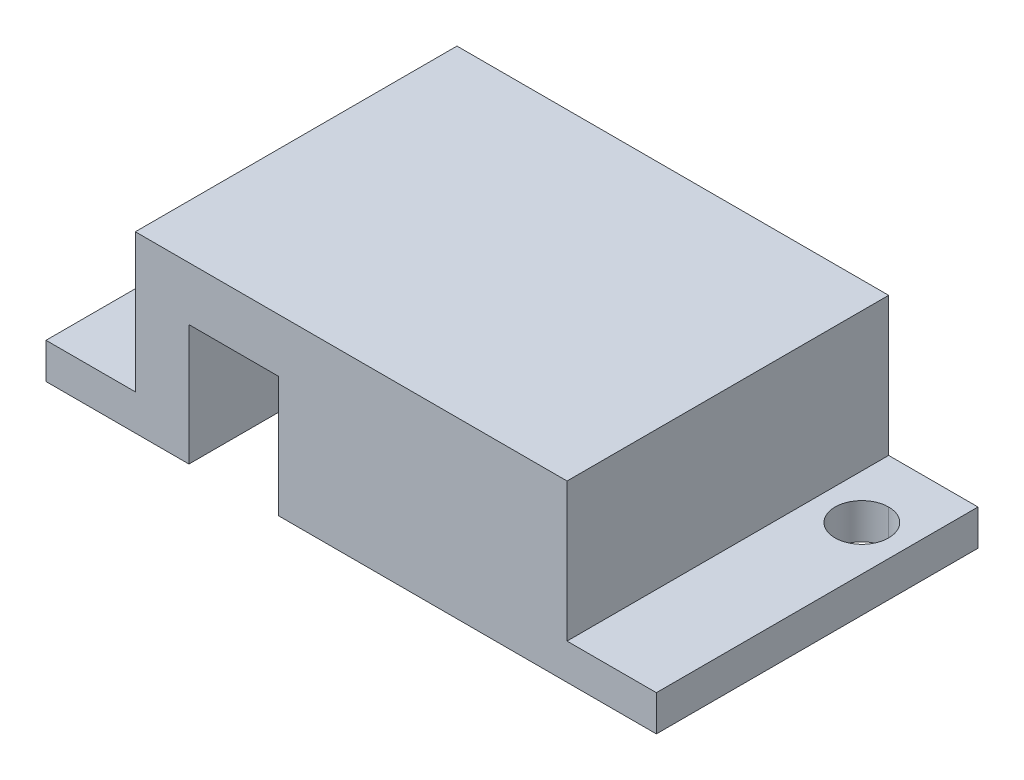
ISO-10303-21;
HEADER;
FILE_DESCRIPTION(('STEP AP214'),'2;1');
FILE_NAME('part.step','',(''),(''),'','','');
FILE_SCHEMA(('AUTOMOTIVE_DESIGN { 1 0 10303 214 1 1 1 1 }'));
ENDSEC;
DATA;
#1=APPLICATION_CONTEXT('core data for automotive mechanical design processes');
#2=APPLICATION_PROTOCOL_DEFINITION('international standard','automotive_design',2000,#1);
#3=PRODUCT_CONTEXT('',#1,'mechanical');
#4=PRODUCT('Part','Part','',(#3));
#5=PRODUCT_RELATED_PRODUCT_CATEGORY('part','',(#4));
#6=PRODUCT_DEFINITION_FORMATION('','',#4);
#7=PRODUCT_DEFINITION_CONTEXT('part definition',#1,'design');
#8=PRODUCT_DEFINITION('design','',#6,#7);
#9=PRODUCT_DEFINITION_SHAPE('','',#8);
#10=(LENGTH_UNIT() NAMED_UNIT(*) SI_UNIT(.MILLI.,.METRE.));
#11=(NAMED_UNIT(*) PLANE_ANGLE_UNIT() SI_UNIT($,.RADIAN.));
#12=(NAMED_UNIT(*) SI_UNIT($,.STERADIAN.) SOLID_ANGLE_UNIT());
#13=UNCERTAINTY_MEASURE_WITH_UNIT(LENGTH_MEASURE(1.E-05),#10,'distance_accuracy_value','');
#14=(GEOMETRIC_REPRESENTATION_CONTEXT(3) GLOBAL_UNCERTAINTY_ASSIGNED_CONTEXT((#13)) GLOBAL_UNIT_ASSIGNED_CONTEXT((#10,
#11,#12)) REPRESENTATION_CONTEXT('',''));
#15=CARTESIAN_POINT('',(0.,0.,0.));
#16=DIRECTION('',(0.,0.,1.));
#17=DIRECTION('',(1.,0.,0.));
#18=AXIS2_PLACEMENT_3D('',#15,#16,#17);
#19=CARTESIAN_POINT('',(-4.23,-17.4578407435232,18.));
#20=DIRECTION('',(1.,0.,0.));
#21=DIRECTION('',(0.,1.,0.));
#22=AXIS2_PLACEMENT_3D('',#19,#20,#21);
#23=PLANE('',#22);
#24=DIRECTION('',(0.,1.,0.));
#25=VECTOR('',#24,1.);
#26=CARTESIAN_POINT('',(-4.23,-17.4578407435232,13.));
#27=LINE('',#26,#25);
#28=CARTESIAN_POINT('',(-4.23,-3.38,13.));
#29=VERTEX_POINT('',#28);
#30=CARTESIAN_POINT('',(-4.23,3.38,13.));
#31=VERTEX_POINT('',#30);
#32=EDGE_CURVE('E10',#29,#31,#27,.T.);
#33=ORIENTED_EDGE('',*,*,#32,.F.);
#34=DIRECTION('',(0.,0.,1.));
#35=VECTOR('',#34,1.);
#36=CARTESIAN_POINT('',(-4.23,-3.38,18.));
#37=LINE('',#36,#35);
#38=CARTESIAN_POINT('',(-4.23,-3.38,18.));
#39=VERTEX_POINT('',#38);
#40=EDGE_CURVE('E190',#29,#39,#37,.T.);
#41=ORIENTED_EDGE('',*,*,#40,.T.);
#42=DIRECTION('',(0.,1.,0.));
#43=VECTOR('',#42,1.);
#44=CARTESIAN_POINT('',(-4.23,-17.4578407435232,18.));
#45=LINE('',#44,#43);
#46=CARTESIAN_POINT('',(-4.23,3.38,18.));
#47=VERTEX_POINT('',#46);
#48=EDGE_CURVE('E24',#39,#47,#45,.T.);
#49=ORIENTED_EDGE('',*,*,#48,.T.);
#50=DIRECTION('',(0.,0.,-1.));
#51=VECTOR('',#50,1.);
#52=CARTESIAN_POINT('',(-4.23,3.38,18.));
#53=LINE('',#52,#51);
#54=EDGE_CURVE('E218',#47,#31,#53,.T.);
#55=ORIENTED_EDGE('',*,*,#54,.T.);
#56=EDGE_LOOP('',(#33,#41,#49,#55));
#57=FACE_BOUND('',#56,.T.);
#58=ADVANCED_FACE('F16',(#57),#23,.F.);
#59=CARTESIAN_POINT('',(-4.23,-17.4578407435232,13.));
#60=DIRECTION('',(0.,0.,1.));
#61=DIRECTION('',(1.,0.,0.));
#62=AXIS2_PLACEMENT_3D('',#59,#60,#61);
#63=PLANE('',#62);
#64=DIRECTION('',(0.,1.,0.));
#65=VECTOR('',#64,1.);
#66=CARTESIAN_POINT('',(8.93,-17.4578407435232,13.));
#67=LINE('',#66,#65);
#68=CARTESIAN_POINT('',(8.93,-3.38,13.));
#69=VERTEX_POINT('',#68);
#70=CARTESIAN_POINT('',(8.93,3.38,13.));
#71=VERTEX_POINT('',#70);
#72=EDGE_CURVE('E196',#69,#71,#67,.T.);
#73=ORIENTED_EDGE('',*,*,#72,.F.);
#74=DIRECTION('',(-1.,0.,0.));
#75=VECTOR('',#74,1.);
#76=CARTESIAN_POINT('',(-4.23,-3.38,13.));
#77=LINE('',#76,#75);
#78=EDGE_CURVE('E183',#69,#29,#77,.T.);
#79=ORIENTED_EDGE('',*,*,#78,.T.);
#80=ORIENTED_EDGE('',*,*,#32,.T.);
#81=DIRECTION('',(1.,0.,0.));
#82=VECTOR('',#81,1.);
#83=CARTESIAN_POINT('',(-4.23,3.38,13.));
#84=LINE('',#83,#82);
#85=EDGE_CURVE('E199',#31,#71,#84,.T.);
#86=ORIENTED_EDGE('',*,*,#85,.T.);
#87=EDGE_LOOP('',(#73,#79,#80,#86));
#88=FACE_BOUND('',#87,.T.);
#89=ADVANCED_FACE('F197',(#88),#63,.F.);
#90=CARTESIAN_POINT('',(0.,0.,18.));
#91=DIRECTION('',(0.,0.,1.));
#92=DIRECTION('',(1.,0.,0.));
#93=AXIS2_PLACEMENT_3D('',#90,#91,#92);
#94=PLANE('',#93);
#95=DIRECTION('',(1.,0.,0.));
#96=VECTOR('',#95,1.);
#97=CARTESIAN_POINT('',(-9.23,3.38,18.));
#98=LINE('',#97,#96);
#99=CARTESIAN_POINT('',(-9.23,3.38,18.));
#100=VERTEX_POINT('',#99);
#101=EDGE_CURVE('E248',#100,#47,#98,.T.);
#102=ORIENTED_EDGE('',*,*,#101,.T.);
#103=ORIENTED_EDGE('',*,*,#48,.F.);
#104=DIRECTION('',(1.,0.,0.));
#105=VECTOR('',#104,1.);
#106=CARTESIAN_POINT('',(8.93,-3.38,18.));
#107=LINE('',#106,#105);
#108=CARTESIAN_POINT('',(16.93,-3.38,18.));
#109=VERTEX_POINT('',#108);
#110=EDGE_CURVE('E219',#39,#109,#107,.T.);
#111=ORIENTED_EDGE('',*,*,#110,.T.);
#112=DIRECTION('',(0.,1.,0.));
#113=VECTOR('',#112,1.);
#114=CARTESIAN_POINT('',(16.93,-3.38,18.));
#115=LINE('',#114,#113);
#116=CARTESIAN_POINT('',(16.93,-1.38,18.));
#117=VERTEX_POINT('',#116);
#118=EDGE_CURVE('E362',#109,#117,#115,.T.);
#119=ORIENTED_EDGE('',*,*,#118,.T.);
#120=DIRECTION('',(-1.,0.,0.));
#121=VECTOR('',#120,1.);
#122=CARTESIAN_POINT('',(16.93,-1.38,18.));
#123=LINE('',#122,#121);
#124=CARTESIAN_POINT('',(11.93,-1.38,18.));
#125=VERTEX_POINT('',#124);
#126=EDGE_CURVE('E353',#117,#125,#123,.T.);
#127=ORIENTED_EDGE('',*,*,#126,.T.);
#128=DIRECTION('',(0.,1.,0.));
#129=VECTOR('',#128,1.);
#130=CARTESIAN_POINT('',(11.93,-1.38,18.));
#131=LINE('',#130,#129);
#132=CARTESIAN_POINT('',(11.93,6.38,18.));
#133=VERTEX_POINT('',#132);
#134=EDGE_CURVE('E343',#125,#133,#131,.T.);
#135=ORIENTED_EDGE('',*,*,#134,.T.);
#136=DIRECTION('',(-1.,0.,0.));
#137=VECTOR('',#136,1.);
#138=CARTESIAN_POINT('',(11.93,6.38,18.));
#139=LINE('',#138,#137);
#140=CARTESIAN_POINT('',(-12.23,6.38,18.));
#141=VERTEX_POINT('',#140);
#142=EDGE_CURVE('E297',#133,#141,#139,.T.);
#143=ORIENTED_EDGE('',*,*,#142,.T.);
#144=DIRECTION('',(0.,-1.,0.));
#145=VECTOR('',#144,1.);
#146=CARTESIAN_POINT('',(-12.23,6.38,18.));
#147=LINE('',#146,#145);
#148=CARTESIAN_POINT('',(-12.23,-1.38,18.));
#149=VERTEX_POINT('',#148);
#150=EDGE_CURVE('E298',#141,#149,#147,.T.);
#151=ORIENTED_EDGE('',*,*,#150,.T.);
#152=DIRECTION('',(-1.,0.,0.));
#153=VECTOR('',#152,1.);
#154=CARTESIAN_POINT('',(-12.23,-1.38,18.));
#155=LINE('',#154,#153);
#156=CARTESIAN_POINT('',(-17.23,-1.38,18.));
#157=VERTEX_POINT('',#156);
#158=EDGE_CURVE('E350',#149,#157,#155,.T.);
#159=ORIENTED_EDGE('',*,*,#158,.T.);
#160=DIRECTION('',(0.,-1.,0.));
#161=VECTOR('',#160,1.);
#162=CARTESIAN_POINT('',(-17.23,-1.38,18.));
#163=LINE('',#162,#161);
#164=CARTESIAN_POINT('',(-17.23,-3.38,18.));
#165=VERTEX_POINT('',#164);
#166=EDGE_CURVE('E325',#157,#165,#163,.T.);
#167=ORIENTED_EDGE('',*,*,#166,.T.);
#168=DIRECTION('',(1.,0.,0.));
#169=VECTOR('',#168,1.);
#170=CARTESIAN_POINT('',(-17.23,-3.38,18.));
#171=LINE('',#170,#169);
#172=CARTESIAN_POINT('',(-9.23,-3.38,18.));
#173=VERTEX_POINT('',#172);
#174=EDGE_CURVE('E236',#165,#173,#171,.T.);
#175=ORIENTED_EDGE('',*,*,#174,.T.);
#176=DIRECTION('',(0.,1.,0.));
#177=VECTOR('',#176,1.);
#178=CARTESIAN_POINT('',(-9.23,-3.38,18.));
#179=LINE('',#178,#177);
#180=EDGE_CURVE('E284',#173,#100,#179,.T.);
#181=ORIENTED_EDGE('',*,*,#180,.T.);
#182=EDGE_LOOP('',(#102,#103,#111,#119,#127,#135,#143,#151,#159,#167,#175,#181));
#183=FACE_BOUND('',#182,.T.);
#184=ADVANCED_FACE('F380',(#183),#94,.T.);
#185=CARTESIAN_POINT('',(14.43,-1.38,4.));
#186=DIRECTION('',(0.,1.,0.));
#187=DIRECTION('',(0.,0.,1.));
#188=AXIS2_PLACEMENT_3D('',#185,#186,#187);
#189=CYLINDRICAL_SURFACE('',#188,1.5);
#190=CARTESIAN_POINT('',(14.43,-3.38,4.));
#191=DIRECTION('',(0.,1.,0.));
#192=DIRECTION('',(0.,0.,1.));
#193=AXIS2_PLACEMENT_3D('',#190,#191,#192);
#194=CIRCLE('',#193,1.5);
#195=CARTESIAN_POINT('',(14.43,-3.38,2.5));
#196=VERTEX_POINT('',#195);
#197=CARTESIAN_POINT('',(14.43,-3.38,5.5));
#198=VERTEX_POINT('',#197);
#199=EDGE_CURVE('E193',#196,#198,#194,.T.);
#200=ORIENTED_EDGE('',*,*,#199,.F.);
#201=DIRECTION('',(0.,1.,0.));
#202=VECTOR('',#201,1.);
#203=CARTESIAN_POINT('',(14.43,-1.38,2.5));
#204=LINE('',#203,#202);
#205=CARTESIAN_POINT('',(14.43,-1.38,2.5));
#206=VERTEX_POINT('',#205);
#207=EDGE_CURVE('E242',#196,#206,#204,.T.);
#208=ORIENTED_EDGE('',*,*,#207,.T.);
#209=CARTESIAN_POINT('',(14.43,-1.38,4.));
#210=DIRECTION('',(0.,1.,0.));
#211=DIRECTION('',(0.,0.,1.));
#212=AXIS2_PLACEMENT_3D('',#209,#210,#211);
#213=CIRCLE('',#212,1.5);
#214=CARTESIAN_POINT('',(14.43,-1.38,5.5));
#215=VERTEX_POINT('',#214);
#216=EDGE_CURVE('E359',#206,#215,#213,.T.);
#217=ORIENTED_EDGE('',*,*,#216,.T.);
#218=DIRECTION('',(0.,1.,0.));
#219=VECTOR('',#218,1.);
#220=CARTESIAN_POINT('',(14.43,-1.38,5.5));
#221=LINE('',#220,#219);
#222=EDGE_CURVE('E233',#198,#215,#221,.T.);
#223=ORIENTED_EDGE('',*,*,#222,.F.);
#224=EDGE_LOOP('',(#200,#208,#217,#223));
#225=FACE_BOUND('',#224,.T.);
#226=ADVANCED_FACE('F649',(#225),#189,.F.);
#227=CARTESIAN_POINT('',(-14.73,-1.38,4.));
#228=DIRECTION('',(0.,1.,0.));
#229=DIRECTION('',(0.,0.,1.));
#230=AXIS2_PLACEMENT_3D('',#227,#228,#229);
#231=CYLINDRICAL_SURFACE('',#230,1.5);
#232=CARTESIAN_POINT('',(-14.73,-3.38,4.));
#233=DIRECTION('',(0.,1.,0.));
#234=DIRECTION('',(0.,0.,1.));
#235=AXIS2_PLACEMENT_3D('',#232,#233,#234);
#236=CIRCLE('',#235,1.5);
#237=CARTESIAN_POINT('',(-14.73,-3.38,2.5));
#238=VERTEX_POINT('',#237);
#239=CARTESIAN_POINT('',(-14.73,-3.38,5.5));
#240=VERTEX_POINT('',#239);
#241=EDGE_CURVE('E347',#238,#240,#236,.T.);
#242=ORIENTED_EDGE('',*,*,#241,.F.);
#243=DIRECTION('',(0.,1.,0.));
#244=VECTOR('',#243,1.);
#245=CARTESIAN_POINT('',(-14.73,-1.38,2.5));
#246=LINE('',#245,#244);
#247=CARTESIAN_POINT('',(-14.73,-1.38,2.5));
#248=VERTEX_POINT('',#247);
#249=EDGE_CURVE('E232',#238,#248,#246,.T.);
#250=ORIENTED_EDGE('',*,*,#249,.T.);
#251=CARTESIAN_POINT('',(-14.73,-1.38,4.));
#252=DIRECTION('',(0.,1.,0.));
#253=DIRECTION('',(0.,0.,1.));
#254=AXIS2_PLACEMENT_3D('',#251,#252,#253);
#255=CIRCLE('',#254,1.49999999999999);
#256=CARTESIAN_POINT('',(-14.73,-1.38,5.5));
#257=VERTEX_POINT('',#256);
#258=EDGE_CURVE('E373',#248,#257,#255,.T.);
#259=ORIENTED_EDGE('',*,*,#258,.T.);
#260=DIRECTION('',(0.,1.,0.));
#261=VECTOR('',#260,1.);
#262=CARTESIAN_POINT('',(-14.73,-1.38,5.5));
#263=LINE('',#262,#261);
#264=EDGE_CURVE('E222',#240,#257,#263,.T.);
#265=ORIENTED_EDGE('',*,*,#264,.F.);
#266=EDGE_LOOP('',(#242,#250,#259,#265));
#267=FACE_BOUND('',#266,.T.);
#268=ADVANCED_FACE('F683',(#267),#231,.F.);
#269=CARTESIAN_POINT('',(0.,-1.38,8.));
#270=DIRECTION('',(0.,-1.,0.));
#271=DIRECTION('',(-1.,0.,0.));
#272=AXIS2_PLACEMENT_3D('',#269,#270,#271);
#273=PLANE('',#272);
#274=CARTESIAN_POINT('',(-14.73,-1.38,4.));
#275=DIRECTION('',(0.,1.,0.));
#276=DIRECTION('',(0.,0.,1.));
#277=AXIS2_PLACEMENT_3D('',#274,#275,#276);
#278=CIRCLE('',#277,1.49999999999999);
#279=EDGE_CURVE('E225',#257,#248,#278,.T.);
#280=ORIENTED_EDGE('',*,*,#279,.F.);
#281=ORIENTED_EDGE('',*,*,#258,.F.);
#282=EDGE_LOOP('',(#280,#281));
#283=FACE_BOUND('',#282,.T.);
#284=DIRECTION('',(-1.,0.,0.));
#285=VECTOR('',#284,1.);
#286=CARTESIAN_POINT('',(0.,-1.38,0.));
#287=LINE('',#286,#285);
#288=CARTESIAN_POINT('',(-12.23,-1.38,0.));
#289=VERTEX_POINT('',#288);
#290=CARTESIAN_POINT('',(-17.23,-1.38,0.));
#291=VERTEX_POINT('',#290);
#292=EDGE_CURVE('E293',#289,#291,#287,.T.);
#293=ORIENTED_EDGE('',*,*,#292,.T.);
#294=DIRECTION('',(0.,0.,-1.));
#295=VECTOR('',#294,1.);
#296=CARTESIAN_POINT('',(-17.23,-1.38,8.));
#297=LINE('',#296,#295);
#298=EDGE_CURVE('E329',#157,#291,#297,.T.);
#299=ORIENTED_EDGE('',*,*,#298,.F.);
#300=ORIENTED_EDGE('',*,*,#158,.F.);
#301=DIRECTION('',(0.,0.,-1.));
#302=VECTOR('',#301,1.);
#303=CARTESIAN_POINT('',(-12.23,-1.38,8.));
#304=LINE('',#303,#302);
#305=EDGE_CURVE('E332',#149,#289,#304,.T.);
#306=ORIENTED_EDGE('',*,*,#305,.T.);
#307=EDGE_LOOP('',(#293,#299,#300,#306));
#308=FACE_BOUND('',#307,.T.);
#309=ADVANCED_FACE('F674',(#283,#308),#273,.F.);
#310=CARTESIAN_POINT('',(0.,-3.38,8.));
#311=DIRECTION('',(0.,-1.,0.));
#312=DIRECTION('',(0.,0.,-1.));
#313=AXIS2_PLACEMENT_3D('',#310,#311,#312);
#314=PLANE('',#313);
#315=CARTESIAN_POINT('',(-14.73,-3.38,4.));
#316=DIRECTION('',(0.,1.,0.));
#317=DIRECTION('',(0.,0.,1.));
#318=AXIS2_PLACEMENT_3D('',#315,#316,#317);
#319=CIRCLE('',#318,1.5);
#320=EDGE_CURVE('E226',#240,#238,#319,.T.);
#321=ORIENTED_EDGE('',*,*,#320,.T.);
#322=ORIENTED_EDGE('',*,*,#241,.T.);
#323=EDGE_LOOP('',(#321,#322));
#324=FACE_BOUND('',#323,.T.);
#325=DIRECTION('',(-1.,0.,0.));
#326=VECTOR('',#325,1.);
#327=CARTESIAN_POINT('',(0.,-3.38,0.));
#328=LINE('',#327,#326);
#329=CARTESIAN_POINT('',(-9.23,-3.38,0.));
#330=VERTEX_POINT('',#329);
#331=CARTESIAN_POINT('',(-17.23,-3.38,0.));
#332=VERTEX_POINT('',#331);
#333=EDGE_CURVE('E261',#330,#332,#328,.T.);
#334=ORIENTED_EDGE('',*,*,#333,.F.);
#335=DIRECTION('',(0.,0.,-1.));
#336=VECTOR('',#335,1.);
#337=CARTESIAN_POINT('',(-9.23,-3.38,8.));
#338=LINE('',#337,#336);
#339=EDGE_CURVE('E319',#173,#330,#338,.T.);
#340=ORIENTED_EDGE('',*,*,#339,.F.);
#341=ORIENTED_EDGE('',*,*,#174,.F.);
#342=DIRECTION('',(0.,0.,-1.));
#343=VECTOR('',#342,1.);
#344=CARTESIAN_POINT('',(-17.23,-3.38,8.));
#345=LINE('',#344,#343);
#346=EDGE_CURVE('E322',#165,#332,#345,.T.);
#347=ORIENTED_EDGE('',*,*,#346,.T.);
#348=EDGE_LOOP('',(#334,#340,#341,#347));
#349=FACE_BOUND('',#348,.T.);
#350=ADVANCED_FACE('F665',(#324,#349),#314,.T.);
#351=CARTESIAN_POINT('',(0.,-3.38,8.));
#352=DIRECTION('',(0.,1.,0.));
#353=DIRECTION('',(1.,0.,0.));
#354=AXIS2_PLACEMENT_3D('',#351,#352,#353);
#355=PLANE('',#354);
#356=CARTESIAN_POINT('',(14.43,-3.38,4.));
#357=DIRECTION('',(0.,1.,0.));
#358=DIRECTION('',(0.,0.,1.));
#359=AXIS2_PLACEMENT_3D('',#356,#357,#358);
#360=CIRCLE('',#359,1.5);
#361=EDGE_CURVE('E257',#198,#196,#360,.T.);
#362=ORIENTED_EDGE('',*,*,#361,.T.);
#363=ORIENTED_EDGE('',*,*,#199,.T.);
#364=EDGE_LOOP('',(#362,#363));
#365=FACE_BOUND('',#364,.T.);
#366=DIRECTION('',(1.,0.,0.));
#367=VECTOR('',#366,1.);
#368=CARTESIAN_POINT('',(0.,-3.38,0.));
#369=LINE('',#368,#367);
#370=CARTESIAN_POINT('',(8.93,-3.38,0.));
#371=VERTEX_POINT('',#370);
#372=CARTESIAN_POINT('',(16.93,-3.38,0.));
#373=VERTEX_POINT('',#372);
#374=EDGE_CURVE('E262',#371,#373,#369,.T.);
#375=ORIENTED_EDGE('',*,*,#374,.T.);
#376=DIRECTION('',(0.,0.,-1.));
#377=VECTOR('',#376,1.);
#378=CARTESIAN_POINT('',(16.93,-3.38,8.));
#379=LINE('',#378,#377);
#380=EDGE_CURVE('E221',#109,#373,#379,.T.);
#381=ORIENTED_EDGE('',*,*,#380,.F.);
#382=ORIENTED_EDGE('',*,*,#110,.F.);
#383=ORIENTED_EDGE('',*,*,#40,.F.);
#384=ORIENTED_EDGE('',*,*,#78,.F.);
#385=DIRECTION('',(0.,0.,-1.));
#386=VECTOR('',#385,1.);
#387=CARTESIAN_POINT('',(8.93,-3.38,8.));
#388=LINE('',#387,#386);
#389=EDGE_CURVE('E188',#69,#371,#388,.T.);
#390=ORIENTED_EDGE('',*,*,#389,.T.);
#391=EDGE_LOOP('',(#375,#381,#382,#383,#384,#390));
#392=FACE_BOUND('',#391,.T.);
#393=ADVANCED_FACE('F186',(#365,#392),#355,.F.);
#394=CARTESIAN_POINT('',(16.93,0.,8.));
#395=DIRECTION('',(-1.,0.,0.));
#396=DIRECTION('',(0.,0.,1.));
#397=AXIS2_PLACEMENT_3D('',#394,#395,#396);
#398=PLANE('',#397);
#399=DIRECTION('',(0.,1.,0.));
#400=VECTOR('',#399,1.);
#401=CARTESIAN_POINT('',(16.93,0.,0.));
#402=LINE('',#401,#400);
#403=CARTESIAN_POINT('',(16.93,-1.38,0.));
#404=VERTEX_POINT('',#403);
#405=EDGE_CURVE('E280',#373,#404,#402,.T.);
#406=ORIENTED_EDGE('',*,*,#405,.T.);
#407=DIRECTION('',(0.,0.,-1.));
#408=VECTOR('',#407,1.);
#409=CARTESIAN_POINT('',(16.93,-1.38,8.));
#410=LINE('',#409,#408);
#411=EDGE_CURVE('E356',#117,#404,#410,.T.);
#412=ORIENTED_EDGE('',*,*,#411,.F.);
#413=ORIENTED_EDGE('',*,*,#118,.F.);
#414=ORIENTED_EDGE('',*,*,#380,.T.);
#415=EDGE_LOOP('',(#406,#412,#413,#414));
#416=FACE_BOUND('',#415,.T.);
#417=ADVANCED_FACE('F580',(#416),#398,.F.);
#418=CARTESIAN_POINT('',(0.,-1.38,8.));
#419=DIRECTION('',(0.,1.,0.));
#420=DIRECTION('',(1.,0.,0.));
#421=AXIS2_PLACEMENT_3D('',#418,#419,#420);
#422=PLANE('',#421);
#423=CARTESIAN_POINT('',(14.43,-1.38,4.));
#424=DIRECTION('',(0.,1.,0.));
#425=DIRECTION('',(0.,0.,1.));
#426=AXIS2_PLACEMENT_3D('',#423,#424,#425);
#427=CIRCLE('',#426,1.5);
#428=EDGE_CURVE('E228',#215,#206,#427,.T.);
#429=ORIENTED_EDGE('',*,*,#428,.F.);
#430=ORIENTED_EDGE('',*,*,#216,.F.);
#431=EDGE_LOOP('',(#429,#430));
#432=FACE_BOUND('',#431,.T.);
#433=DIRECTION('',(1.,0.,0.));
#434=VECTOR('',#433,1.);
#435=CARTESIAN_POINT('',(0.,-1.38,0.));
#436=LINE('',#435,#434);
#437=CARTESIAN_POINT('',(11.93,-1.38,0.));
#438=VERTEX_POINT('',#437);
#439=EDGE_CURVE('E285',#438,#404,#436,.T.);
#440=ORIENTED_EDGE('',*,*,#439,.F.);
#441=DIRECTION('',(0.,0.,-1.));
#442=VECTOR('',#441,1.);
#443=CARTESIAN_POINT('',(11.93,-1.38,8.));
#444=LINE('',#443,#442);
#445=EDGE_CURVE('E346',#125,#438,#444,.T.);
#446=ORIENTED_EDGE('',*,*,#445,.F.);
#447=ORIENTED_EDGE('',*,*,#126,.F.);
#448=ORIENTED_EDGE('',*,*,#411,.T.);
#449=EDGE_LOOP('',(#440,#446,#447,#448));
#450=FACE_BOUND('',#449,.T.);
#451=ADVANCED_FACE('F575',(#432,#450),#422,.T.);
#452=CARTESIAN_POINT('',(11.93,0.,8.));
#453=DIRECTION('',(-1.,0.,0.));
#454=DIRECTION('',(0.,0.,1.));
#455=AXIS2_PLACEMENT_3D('',#452,#453,#454);
#456=PLANE('',#455);
#457=DIRECTION('',(0.,1.,0.));
#458=VECTOR('',#457,1.);
#459=CARTESIAN_POINT('',(11.93,0.,0.));
#460=LINE('',#459,#458);
#461=CARTESIAN_POINT('',(11.93,6.38,0.));
#462=VERTEX_POINT('',#461);
#463=EDGE_CURVE('E310',#438,#462,#460,.T.);
#464=ORIENTED_EDGE('',*,*,#463,.T.);
#465=DIRECTION('',(0.,0.,-1.));
#466=VECTOR('',#465,1.);
#467=CARTESIAN_POINT('',(11.93,6.38,8.));
#468=LINE('',#467,#466);
#469=EDGE_CURVE('E340',#133,#462,#468,.T.);
#470=ORIENTED_EDGE('',*,*,#469,.F.);
#471=ORIENTED_EDGE('',*,*,#134,.F.);
#472=ORIENTED_EDGE('',*,*,#445,.T.);
#473=EDGE_LOOP('',(#464,#470,#471,#472));
#474=FACE_BOUND('',#473,.T.);
#475=ADVANCED_FACE('F579',(#474),#456,.F.);
#476=CARTESIAN_POINT('',(0.,6.38,8.));
#477=DIRECTION('',(0.,1.,0.));
#478=DIRECTION('',(1.,0.,0.));
#479=AXIS2_PLACEMENT_3D('',#476,#477,#478);
#480=PLANE('',#479);
#481=DIRECTION('',(1.,0.,0.));
#482=VECTOR('',#481,1.);
#483=CARTESIAN_POINT('',(0.,6.38,0.));
#484=LINE('',#483,#482);
#485=CARTESIAN_POINT('',(-12.23,6.38,0.));
#486=VERTEX_POINT('',#485);
#487=EDGE_CURVE('E306',#486,#462,#484,.T.);
#488=ORIENTED_EDGE('',*,*,#487,.F.);
#489=DIRECTION('',(0.,0.,-1.));
#490=VECTOR('',#489,1.);
#491=CARTESIAN_POINT('',(-12.23,6.38,8.));
#492=LINE('',#491,#490);
#493=EDGE_CURVE('E294',#141,#486,#492,.T.);
#494=ORIENTED_EDGE('',*,*,#493,.F.);
#495=ORIENTED_EDGE('',*,*,#142,.F.);
#496=ORIENTED_EDGE('',*,*,#469,.T.);
#497=EDGE_LOOP('',(#488,#494,#495,#496));
#498=FACE_BOUND('',#497,.T.);
#499=ADVANCED_FACE('F624',(#498),#480,.T.);
#500=CARTESIAN_POINT('',(-12.23,0.,8.));
#501=DIRECTION('',(-1.,0.,0.));
#502=DIRECTION('',(0.,1.,0.));
#503=AXIS2_PLACEMENT_3D('',#500,#501,#502);
#504=PLANE('',#503);
#505=DIRECTION('',(0.,1.,0.));
#506=VECTOR('',#505,1.);
#507=CARTESIAN_POINT('',(-12.23,0.,0.));
#508=LINE('',#507,#506);
#509=EDGE_CURVE('E302',#289,#486,#508,.T.);
#510=ORIENTED_EDGE('',*,*,#509,.F.);
#511=ORIENTED_EDGE('',*,*,#305,.F.);
#512=ORIENTED_EDGE('',*,*,#150,.F.);
#513=ORIENTED_EDGE('',*,*,#493,.T.);
#514=EDGE_LOOP('',(#510,#511,#512,#513));
#515=FACE_BOUND('',#514,.T.);
#516=ADVANCED_FACE('F615',(#515),#504,.T.);
#517=CARTESIAN_POINT('',(-17.23,0.,8.));
#518=DIRECTION('',(-1.,0.,0.));
#519=DIRECTION('',(0.,0.,1.));
#520=AXIS2_PLACEMENT_3D('',#517,#518,#519);
#521=PLANE('',#520);
#522=DIRECTION('',(0.,1.,0.));
#523=VECTOR('',#522,1.);
#524=CARTESIAN_POINT('',(-17.23,0.,0.));
#525=LINE('',#524,#523);
#526=EDGE_CURVE('E289',#332,#291,#525,.T.);
#527=ORIENTED_EDGE('',*,*,#526,.F.);
#528=ORIENTED_EDGE('',*,*,#346,.F.);
#529=ORIENTED_EDGE('',*,*,#166,.F.);
#530=ORIENTED_EDGE('',*,*,#298,.T.);
#531=EDGE_LOOP('',(#527,#528,#529,#530));
#532=FACE_BOUND('',#531,.T.);
#533=ADVANCED_FACE('F606',(#532),#521,.T.);
#534=CARTESIAN_POINT('',(-9.23,0.,8.));
#535=DIRECTION('',(-1.,0.,0.));
#536=DIRECTION('',(0.,0.,1.));
#537=AXIS2_PLACEMENT_3D('',#534,#535,#536);
#538=PLANE('',#537);
#539=DIRECTION('',(0.,1.,0.));
#540=VECTOR('',#539,1.);
#541=CARTESIAN_POINT('',(-9.23,0.,0.));
#542=LINE('',#541,#540);
#543=CARTESIAN_POINT('',(-9.23,3.38,0.));
#544=VERTEX_POINT('',#543);
#545=EDGE_CURVE('E258',#330,#544,#542,.T.);
#546=ORIENTED_EDGE('',*,*,#545,.T.);
#547=DIRECTION('',(0.,0.,-1.));
#548=VECTOR('',#547,1.);
#549=CARTESIAN_POINT('',(-9.23,3.38,8.));
#550=LINE('',#549,#548);
#551=EDGE_CURVE('E243',#100,#544,#550,.T.);
#552=ORIENTED_EDGE('',*,*,#551,.F.);
#553=ORIENTED_EDGE('',*,*,#180,.F.);
#554=ORIENTED_EDGE('',*,*,#339,.T.);
#555=EDGE_LOOP('',(#546,#552,#553,#554));
#556=FACE_BOUND('',#555,.T.);
#557=ADVANCED_FACE('F597',(#556),#538,.F.);
#558=CARTESIAN_POINT('',(0.,0.,0.));
#559=DIRECTION('',(0.,0.,1.));
#560=DIRECTION('',(1.,0.,0.));
#561=AXIS2_PLACEMENT_3D('',#558,#559,#560);
#562=PLANE('',#561);
#563=ORIENTED_EDGE('',*,*,#374,.F.);
#564=DIRECTION('',(0.,1.,0.));
#565=VECTOR('',#564,1.);
#566=CARTESIAN_POINT('',(8.93,0.,0.));
#567=LINE('',#566,#565);
#568=CARTESIAN_POINT('',(8.93,3.38,0.));
#569=VERTEX_POINT('',#568);
#570=EDGE_CURVE('E209',#371,#569,#567,.T.);
#571=ORIENTED_EDGE('',*,*,#570,.T.);
#572=DIRECTION('',(1.,0.,0.));
#573=VECTOR('',#572,1.);
#574=CARTESIAN_POINT('',(0.,3.38,0.));
#575=LINE('',#574,#573);
#576=EDGE_CURVE('E239',#544,#569,#575,.T.);
#577=ORIENTED_EDGE('',*,*,#576,.F.);
#578=ORIENTED_EDGE('',*,*,#545,.F.);
#579=ORIENTED_EDGE('',*,*,#333,.T.);
#580=ORIENTED_EDGE('',*,*,#526,.T.);
#581=ORIENTED_EDGE('',*,*,#292,.F.);
#582=ORIENTED_EDGE('',*,*,#509,.T.);
#583=ORIENTED_EDGE('',*,*,#487,.T.);
#584=ORIENTED_EDGE('',*,*,#463,.F.);
#585=ORIENTED_EDGE('',*,*,#439,.T.);
#586=ORIENTED_EDGE('',*,*,#405,.F.);
#587=EDGE_LOOP('',(#563,#571,#577,#578,#579,#580,#581,#582,#583,#584,#585,#586));
#588=FACE_BOUND('',#587,.T.);
#589=ADVANCED_FACE('F569',(#588),#562,.F.);
#590=CARTESIAN_POINT('',(-14.73,-1.38,4.));
#591=DIRECTION('',(0.,1.,0.));
#592=DIRECTION('',(0.,0.,1.));
#593=AXIS2_PLACEMENT_3D('',#590,#591,#592);
#594=CYLINDRICAL_SURFACE('',#593,1.5);
#595=ORIENTED_EDGE('',*,*,#249,.F.);
#596=ORIENTED_EDGE('',*,*,#320,.F.);
#597=ORIENTED_EDGE('',*,*,#264,.T.);
#598=ORIENTED_EDGE('',*,*,#279,.T.);
#599=EDGE_LOOP('',(#595,#596,#597,#598));
#600=FACE_BOUND('',#599,.T.);
#601=ADVANCED_FACE('F565',(#600),#594,.F.);
#602=CARTESIAN_POINT('',(14.43,-1.38,4.));
#603=DIRECTION('',(0.,1.,0.));
#604=DIRECTION('',(0.,0.,1.));
#605=AXIS2_PLACEMENT_3D('',#602,#603,#604);
#606=CYLINDRICAL_SURFACE('',#605,1.5);
#607=ORIENTED_EDGE('',*,*,#207,.F.);
#608=ORIENTED_EDGE('',*,*,#361,.F.);
#609=ORIENTED_EDGE('',*,*,#222,.T.);
#610=ORIENTED_EDGE('',*,*,#428,.T.);
#611=EDGE_LOOP('',(#607,#608,#609,#610));
#612=FACE_BOUND('',#611,.T.);
#613=ADVANCED_FACE('F560',(#612),#606,.F.);
#614=CARTESIAN_POINT('',(0.,3.38,8.));
#615=DIRECTION('',(0.,1.,0.));
#616=DIRECTION('',(1.,0.,0.));
#617=AXIS2_PLACEMENT_3D('',#614,#615,#616);
#618=PLANE('',#617);
#619=ORIENTED_EDGE('',*,*,#85,.F.);
#620=ORIENTED_EDGE('',*,*,#54,.F.);
#621=ORIENTED_EDGE('',*,*,#101,.F.);
#622=ORIENTED_EDGE('',*,*,#551,.T.);
#623=ORIENTED_EDGE('',*,*,#576,.T.);
#624=DIRECTION('',(0.,0.,-1.));
#625=VECTOR('',#624,1.);
#626=CARTESIAN_POINT('',(8.93,3.38,8.));
#627=LINE('',#626,#625);
#628=EDGE_CURVE('E204',#71,#569,#627,.T.);
#629=ORIENTED_EDGE('',*,*,#628,.F.);
#630=EDGE_LOOP('',(#619,#620,#621,#622,#623,#629));
#631=FACE_BOUND('',#630,.T.);
#632=ADVANCED_FACE('F384',(#631),#618,.F.);
#633=CARTESIAN_POINT('',(8.93,0.,8.));
#634=DIRECTION('',(-1.,0.,0.));
#635=DIRECTION('',(0.,0.,1.));
#636=AXIS2_PLACEMENT_3D('',#633,#634,#635);
#637=PLANE('',#636);
#638=ORIENTED_EDGE('',*,*,#389,.F.);
#639=ORIENTED_EDGE('',*,*,#72,.T.);
#640=ORIENTED_EDGE('',*,*,#628,.T.);
#641=ORIENTED_EDGE('',*,*,#570,.F.);
#642=EDGE_LOOP('',(#638,#639,#640,#641));
#643=FACE_BOUND('',#642,.T.);
#644=ADVANCED_FACE('F207',(#643),#637,.T.);
#645=CLOSED_SHELL('',(#58,#89,#184,#226,#268,#309,#350,#393,#417,#451,#475,#499,#516,#533,#557,
#589,#601,#613,#632,#644));
#646=MANIFOLD_SOLID_BREP('B1',#645);
#647=ADVANCED_BREP_SHAPE_REPRESENTATION('',(#18,#646),#14);
#648=SHAPE_DEFINITION_REPRESENTATION(#9,#647);
ENDSEC;
END-ISO-10303-21;
